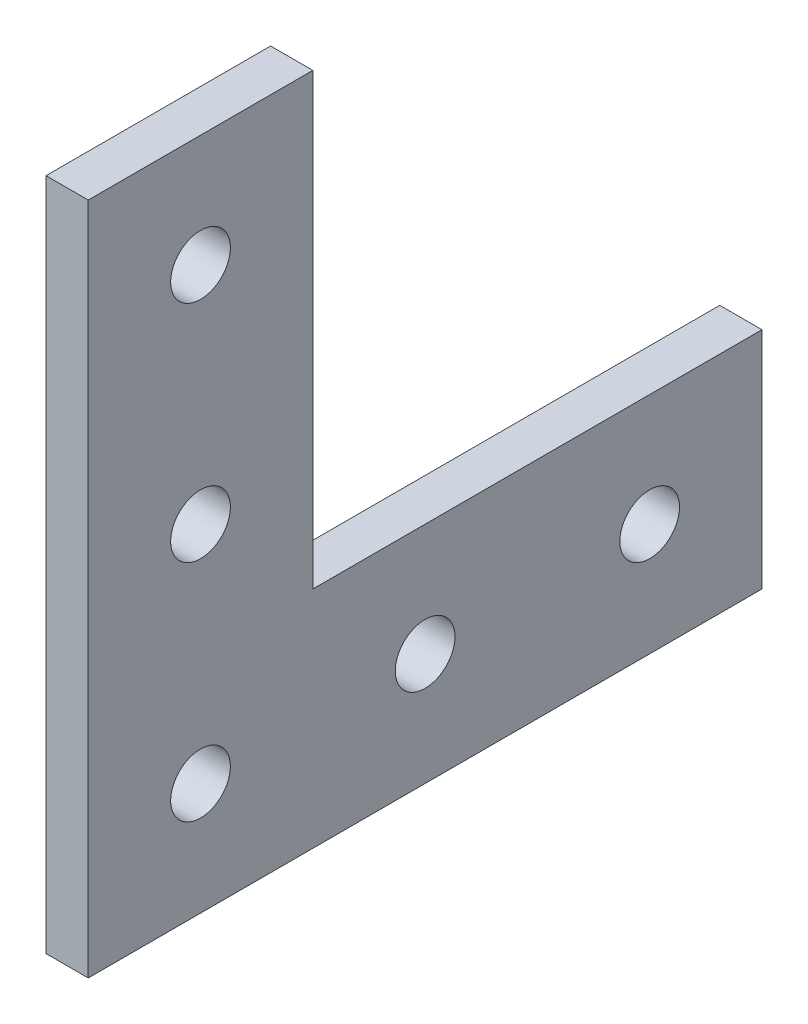
ISO-10303-21;
HEADER;
FILE_DESCRIPTION(('STEP AP214'),'2;1');
FILE_NAME('part.step','',(''),(''),'','','');
FILE_SCHEMA(('AUTOMOTIVE_DESIGN { 1 0 10303 214 1 1 1 1 }'));
ENDSEC;
DATA;
#1=APPLICATION_CONTEXT('core data for automotive mechanical design processes');
#2=APPLICATION_PROTOCOL_DEFINITION('international standard','automotive_design',2000,#1);
#3=PRODUCT_CONTEXT('',#1,'mechanical');
#4=PRODUCT('Part','Part','',(#3));
#5=PRODUCT_RELATED_PRODUCT_CATEGORY('part','',(#4));
#6=PRODUCT_DEFINITION_FORMATION('','',#4);
#7=PRODUCT_DEFINITION_CONTEXT('part definition',#1,'design');
#8=PRODUCT_DEFINITION('design','',#6,#7);
#9=PRODUCT_DEFINITION_SHAPE('','',#8);
#10=(LENGTH_UNIT() NAMED_UNIT(*) SI_UNIT(.MILLI.,.METRE.));
#11=(NAMED_UNIT(*) PLANE_ANGLE_UNIT() SI_UNIT($,.RADIAN.));
#12=(NAMED_UNIT(*) SI_UNIT($,.STERADIAN.) SOLID_ANGLE_UNIT());
#13=UNCERTAINTY_MEASURE_WITH_UNIT(LENGTH_MEASURE(1.E-05),#10,'distance_accuracy_value','');
#14=(GEOMETRIC_REPRESENTATION_CONTEXT(3) GLOBAL_UNCERTAINTY_ASSIGNED_CONTEXT((#13)) GLOBAL_UNIT_ASSIGNED_CONTEXT((#10,
#11,#12)) REPRESENTATION_CONTEXT('',''));
#15=CARTESIAN_POINT('',(0.,0.,0.));
#16=DIRECTION('',(0.,0.,1.));
#17=DIRECTION('',(1.,0.,0.));
#18=AXIS2_PLACEMENT_3D('',#15,#16,#17);
#19=CARTESIAN_POINT('',(4.7752,0.,0.));
#20=DIRECTION('',(0.,-1.,0.));
#21=DIRECTION('',(0.,0.,-1.));
#22=AXIS2_PLACEMENT_3D('',#19,#20,#21);
#23=PLANE('',#22);
#24=DIRECTION('',(0.,0.,1.));
#25=VECTOR('',#24,1.);
#26=CARTESIAN_POINT('',(0.,0.,0.));
#27=LINE('',#26,#25);
#28=CARTESIAN_POINT('',(0.,0.,-50.8));
#29=VERTEX_POINT('',#28);
#30=CARTESIAN_POINT('',(0.,0.,0.));
#31=VERTEX_POINT('',#30);
#32=EDGE_CURVE('E119',#29,#31,#27,.T.);
#33=ORIENTED_EDGE('',*,*,#32,.T.);
#34=DIRECTION('',(-1.,0.,0.));
#35=VECTOR('',#34,1.);
#36=CARTESIAN_POINT('',(4.7752,0.,0.));
#37=LINE('',#36,#35);
#38=CARTESIAN_POINT('',(4.7752,0.,0.));
#39=VERTEX_POINT('',#38);
#40=EDGE_CURVE('E11',#39,#31,#37,.T.);
#41=ORIENTED_EDGE('',*,*,#40,.F.);
#42=DIRECTION('',(0.,0.,1.));
#43=VECTOR('',#42,1.);
#44=CARTESIAN_POINT('',(4.7752,0.,0.));
#45=LINE('',#44,#43);
#46=CARTESIAN_POINT('',(4.7752,0.,-50.8));
#47=VERTEX_POINT('',#46);
#48=EDGE_CURVE('E130',#47,#39,#45,.T.);
#49=ORIENTED_EDGE('',*,*,#48,.F.);
#50=DIRECTION('',(-1.,0.,0.));
#51=VECTOR('',#50,1.);
#52=CARTESIAN_POINT('',(4.7752,0.,-50.8));
#53=LINE('',#52,#51);
#54=EDGE_CURVE('E115',#47,#29,#53,.T.);
#55=ORIENTED_EDGE('',*,*,#54,.T.);
#56=EDGE_LOOP('',(#33,#41,#49,#55));
#57=FACE_BOUND('',#56,.T.);
#58=ADVANCED_FACE('F34',(#57),#23,.F.);
#59=CARTESIAN_POINT('',(4.7752,0.,0.));
#60=DIRECTION('',(0.,0.,1.));
#61=DIRECTION('',(0.,-1.,0.));
#62=AXIS2_PLACEMENT_3D('',#59,#60,#61);
#63=PLANE('',#62);
#64=DIRECTION('',(0.,1.,0.));
#65=VECTOR('',#64,1.);
#66=CARTESIAN_POINT('',(0.,0.,0.));
#67=LINE('',#66,#65);
#68=CARTESIAN_POINT('',(0.,50.8,0.));
#69=VERTEX_POINT('',#68);
#70=EDGE_CURVE('E122',#31,#69,#67,.T.);
#71=ORIENTED_EDGE('',*,*,#70,.T.);
#72=DIRECTION('',(-1.,0.,0.));
#73=VECTOR('',#72,1.);
#74=CARTESIAN_POINT('',(4.7752,50.8,0.));
#75=LINE('',#74,#73);
#76=CARTESIAN_POINT('',(4.7752,50.8,0.));
#77=VERTEX_POINT('',#76);
#78=EDGE_CURVE('E43',#77,#69,#75,.T.);
#79=ORIENTED_EDGE('',*,*,#78,.F.);
#80=DIRECTION('',(0.,1.,0.));
#81=VECTOR('',#80,1.);
#82=CARTESIAN_POINT('',(4.7752,0.,0.));
#83=LINE('',#82,#81);
#84=EDGE_CURVE('E88',#39,#77,#83,.T.);
#85=ORIENTED_EDGE('',*,*,#84,.F.);
#86=ORIENTED_EDGE('',*,*,#40,.T.);
#87=EDGE_LOOP('',(#71,#79,#85,#86));
#88=FACE_BOUND('',#87,.T.);
#89=ADVANCED_FACE('F156',(#88),#63,.F.);
#90=CARTESIAN_POINT('',(4.7752,50.8,25.4));
#91=DIRECTION('',(0.,-1.,0.));
#92=DIRECTION('',(0.,0.,-1.));
#93=AXIS2_PLACEMENT_3D('',#90,#91,#92);
#94=PLANE('',#93);
#95=DIRECTION('',(0.,0.,1.));
#96=VECTOR('',#95,1.);
#97=CARTESIAN_POINT('',(0.,50.8,25.4));
#98=LINE('',#97,#96);
#99=CARTESIAN_POINT('',(0.,50.8,25.4));
#100=VERTEX_POINT('',#99);
#101=EDGE_CURVE('E125',#69,#100,#98,.T.);
#102=ORIENTED_EDGE('',*,*,#101,.T.);
#103=DIRECTION('',(-1.,0.,0.));
#104=VECTOR('',#103,1.);
#105=CARTESIAN_POINT('',(4.7752,50.8,25.4));
#106=LINE('',#105,#104);
#107=CARTESIAN_POINT('',(4.7752,50.8,25.4));
#108=VERTEX_POINT('',#107);
#109=EDGE_CURVE('E110',#108,#100,#106,.T.);
#110=ORIENTED_EDGE('',*,*,#109,.F.);
#111=DIRECTION('',(0.,0.,1.));
#112=VECTOR('',#111,1.);
#113=CARTESIAN_POINT('',(4.7752,50.8,25.4));
#114=LINE('',#113,#112);
#115=EDGE_CURVE('E101',#77,#108,#114,.T.);
#116=ORIENTED_EDGE('',*,*,#115,.F.);
#117=ORIENTED_EDGE('',*,*,#78,.T.);
#118=EDGE_LOOP('',(#102,#110,#116,#117));
#119=FACE_BOUND('',#118,.T.);
#120=ADVANCED_FACE('F137',(#119),#94,.F.);
#121=CARTESIAN_POINT('',(4.7752,-25.4,25.4));
#122=DIRECTION('',(0.,0.,-1.));
#123=DIRECTION('',(0.,1.,0.));
#124=AXIS2_PLACEMENT_3D('',#121,#122,#123);
#125=PLANE('',#124);
#126=DIRECTION('',(0.,-1.,0.));
#127=VECTOR('',#126,1.);
#128=CARTESIAN_POINT('',(0.,-25.4,25.4));
#129=LINE('',#128,#127);
#130=CARTESIAN_POINT('',(0.,-25.4,25.4));
#131=VERTEX_POINT('',#130);
#132=EDGE_CURVE('E109',#100,#131,#129,.T.);
#133=ORIENTED_EDGE('',*,*,#132,.T.);
#134=DIRECTION('',(-1.,0.,0.));
#135=VECTOR('',#134,1.);
#136=CARTESIAN_POINT('',(4.7752,-25.4,25.4));
#137=LINE('',#136,#135);
#138=CARTESIAN_POINT('',(4.7752,-25.4,25.4));
#139=VERTEX_POINT('',#138);
#140=EDGE_CURVE('E106',#139,#131,#137,.T.);
#141=ORIENTED_EDGE('',*,*,#140,.F.);
#142=DIRECTION('',(0.,-1.,0.));
#143=VECTOR('',#142,1.);
#144=CARTESIAN_POINT('',(4.7752,-25.4,25.4));
#145=LINE('',#144,#143);
#146=EDGE_CURVE('E95',#108,#139,#145,.T.);
#147=ORIENTED_EDGE('',*,*,#146,.F.);
#148=ORIENTED_EDGE('',*,*,#109,.T.);
#149=EDGE_LOOP('',(#133,#141,#147,#148));
#150=FACE_BOUND('',#149,.T.);
#151=ADVANCED_FACE('F107',(#150),#125,.F.);
#152=CARTESIAN_POINT('',(4.7752,-25.4,25.4));
#153=DIRECTION('',(0.,1.,0.));
#154=DIRECTION('',(0.,0.,1.));
#155=AXIS2_PLACEMENT_3D('',#152,#153,#154);
#156=PLANE('',#155);
#157=DIRECTION('',(0.,0.,-1.));
#158=VECTOR('',#157,1.);
#159=CARTESIAN_POINT('',(0.,-25.4,25.4));
#160=LINE('',#159,#158);
#161=CARTESIAN_POINT('',(0.,-25.4,-50.8));
#162=VERTEX_POINT('',#161);
#163=EDGE_CURVE('E74',#131,#162,#160,.T.);
#164=ORIENTED_EDGE('',*,*,#163,.T.);
#165=DIRECTION('',(-1.,0.,0.));
#166=VECTOR('',#165,1.);
#167=CARTESIAN_POINT('',(4.7752,-25.4,-50.8));
#168=LINE('',#167,#166);
#169=CARTESIAN_POINT('',(4.7752,-25.4,-50.8));
#170=VERTEX_POINT('',#169);
#171=EDGE_CURVE('E111',#170,#162,#168,.T.);
#172=ORIENTED_EDGE('',*,*,#171,.F.);
#173=DIRECTION('',(0.,0.,-1.));
#174=VECTOR('',#173,1.);
#175=CARTESIAN_POINT('',(4.7752,-25.4,25.4));
#176=LINE('',#175,#174);
#177=EDGE_CURVE('E99',#139,#170,#176,.T.);
#178=ORIENTED_EDGE('',*,*,#177,.F.);
#179=ORIENTED_EDGE('',*,*,#140,.T.);
#180=EDGE_LOOP('',(#164,#172,#178,#179));
#181=FACE_BOUND('',#180,.T.);
#182=ADVANCED_FACE('F113',(#181),#156,.F.);
#183=CARTESIAN_POINT('',(4.7752,0.,-50.8));
#184=DIRECTION('',(0.,0.,1.));
#185=DIRECTION('',(1.,0.,0.));
#186=AXIS2_PLACEMENT_3D('',#183,#184,#185);
#187=PLANE('',#186);
#188=DIRECTION('',(0.,1.,0.));
#189=VECTOR('',#188,1.);
#190=CARTESIAN_POINT('',(0.,0.,-50.8));
#191=LINE('',#190,#189);
#192=EDGE_CURVE('E80',#162,#29,#191,.T.);
#193=ORIENTED_EDGE('',*,*,#192,.T.);
#194=ORIENTED_EDGE('',*,*,#54,.F.);
#195=DIRECTION('',(0.,1.,0.));
#196=VECTOR('',#195,1.);
#197=CARTESIAN_POINT('',(4.7752,0.,-50.8));
#198=LINE('',#197,#196);
#199=EDGE_CURVE('E51',#170,#47,#198,.T.);
#200=ORIENTED_EDGE('',*,*,#199,.F.);
#201=ORIENTED_EDGE('',*,*,#171,.T.);
#202=EDGE_LOOP('',(#193,#194,#200,#201));
#203=FACE_BOUND('',#202,.T.);
#204=ADVANCED_FACE('F144',(#203),#187,.F.);
#205=CARTESIAN_POINT('',(4.7752,0.,0.));
#206=DIRECTION('',(-1.,0.,0.));
#207=DIRECTION('',(0.,0.,1.));
#208=AXIS2_PLACEMENT_3D('',#205,#206,#207);
#209=PLANE('',#208);
#210=CARTESIAN_POINT('',(4.7752,-12.7,12.7));
#211=DIRECTION('',(1.,0.,0.));
#212=DIRECTION('',(0.,0.,-1.));
#213=AXIS2_PLACEMENT_3D('',#210,#211,#212);
#214=CIRCLE('',#213,3.3782);
#215=CARTESIAN_POINT('',(4.7752,-12.7,9.32179999999999));
#216=VERTEX_POINT('',#215);
#217=EDGE_CURVE('E252',#216,#216,#214,.T.);
#218=ORIENTED_EDGE('',*,*,#217,.F.);
#219=EDGE_LOOP('',(#218));
#220=FACE_BOUND('',#219,.T.);
#221=CARTESIAN_POINT('',(4.7752,-12.7,-12.7));
#222=DIRECTION('',(1.,0.,0.));
#223=DIRECTION('',(0.,0.,-1.));
#224=AXIS2_PLACEMENT_3D('',#221,#222,#223);
#225=CIRCLE('',#224,3.3782);
#226=CARTESIAN_POINT('',(4.7752,-12.7,-16.0782));
#227=VERTEX_POINT('',#226);
#228=EDGE_CURVE('E254',#227,#227,#225,.T.);
#229=ORIENTED_EDGE('',*,*,#228,.F.);
#230=EDGE_LOOP('',(#229));
#231=FACE_BOUND('',#230,.T.);
#232=CARTESIAN_POINT('',(4.7752,-12.7,-38.1));
#233=DIRECTION('',(1.,0.,0.));
#234=DIRECTION('',(0.,0.,-1.));
#235=AXIS2_PLACEMENT_3D('',#232,#233,#234);
#236=CIRCLE('',#235,3.3782);
#237=CARTESIAN_POINT('',(4.7752,-12.7,-41.4782));
#238=VERTEX_POINT('',#237);
#239=EDGE_CURVE('E262',#238,#238,#236,.T.);
#240=ORIENTED_EDGE('',*,*,#239,.F.);
#241=EDGE_LOOP('',(#240));
#242=FACE_BOUND('',#241,.T.);
#243=CARTESIAN_POINT('',(4.7752,12.7,12.7));
#244=DIRECTION('',(1.,0.,0.));
#245=DIRECTION('',(0.,0.,-1.));
#246=AXIS2_PLACEMENT_3D('',#243,#244,#245);
#247=CIRCLE('',#246,3.3782);
#248=CARTESIAN_POINT('',(4.7752,12.7,9.3218));
#249=VERTEX_POINT('',#248);
#250=EDGE_CURVE('E265',#249,#249,#247,.T.);
#251=ORIENTED_EDGE('',*,*,#250,.F.);
#252=EDGE_LOOP('',(#251));
#253=FACE_BOUND('',#252,.T.);
#254=CARTESIAN_POINT('',(4.7752,38.1,12.7));
#255=DIRECTION('',(1.,0.,0.));
#256=DIRECTION('',(0.,0.,-1.));
#257=AXIS2_PLACEMENT_3D('',#254,#255,#256);
#258=CIRCLE('',#257,3.3782);
#259=CARTESIAN_POINT('',(4.7752,38.1,9.3218));
#260=VERTEX_POINT('',#259);
#261=EDGE_CURVE('E271',#260,#260,#258,.T.);
#262=ORIENTED_EDGE('',*,*,#261,.F.);
#263=EDGE_LOOP('',(#262));
#264=FACE_BOUND('',#263,.T.);
#265=ORIENTED_EDGE('',*,*,#48,.T.);
#266=ORIENTED_EDGE('',*,*,#84,.T.);
#267=ORIENTED_EDGE('',*,*,#115,.T.);
#268=ORIENTED_EDGE('',*,*,#146,.T.);
#269=ORIENTED_EDGE('',*,*,#177,.T.);
#270=ORIENTED_EDGE('',*,*,#199,.T.);
#271=EDGE_LOOP('',(#265,#266,#267,#268,#269,#270));
#272=FACE_BOUND('',#271,.T.);
#273=ADVANCED_FACE('F97',(#220,#231,#242,#253,#264,#272),#209,.F.);
#274=CARTESIAN_POINT('',(0.,0.,0.));
#275=DIRECTION('',(-1.,0.,0.));
#276=DIRECTION('',(0.,0.,1.));
#277=AXIS2_PLACEMENT_3D('',#274,#275,#276);
#278=PLANE('',#277);
#279=CARTESIAN_POINT('',(0.,-12.7,12.7));
#280=DIRECTION('',(-1.,0.,0.));
#281=DIRECTION('',(0.,0.,1.));
#282=AXIS2_PLACEMENT_3D('',#279,#280,#281);
#283=CIRCLE('',#282,3.3782);
#284=CARTESIAN_POINT('',(0.,-12.7,16.0782));
#285=VERTEX_POINT('',#284);
#286=EDGE_CURVE('E249',#285,#285,#283,.T.);
#287=ORIENTED_EDGE('',*,*,#286,.F.);
#288=EDGE_LOOP('',(#287));
#289=FACE_BOUND('',#288,.T.);
#290=CARTESIAN_POINT('',(0.,-12.7,-12.7));
#291=DIRECTION('',(-1.,0.,0.));
#292=DIRECTION('',(0.,0.,1.));
#293=AXIS2_PLACEMENT_3D('',#290,#291,#292);
#294=CIRCLE('',#293,3.3782);
#295=CARTESIAN_POINT('',(0.,-12.7,-9.32180000000001));
#296=VERTEX_POINT('',#295);
#297=EDGE_CURVE('E259',#296,#296,#294,.T.);
#298=ORIENTED_EDGE('',*,*,#297,.F.);
#299=EDGE_LOOP('',(#298));
#300=FACE_BOUND('',#299,.T.);
#301=CARTESIAN_POINT('',(0.,-12.7,-38.1));
#302=DIRECTION('',(-1.,0.,0.));
#303=DIRECTION('',(0.,0.,1.));
#304=AXIS2_PLACEMENT_3D('',#301,#302,#303);
#305=CIRCLE('',#304,3.3782);
#306=CARTESIAN_POINT('',(0.,-12.7,-34.7218));
#307=VERTEX_POINT('',#306);
#308=EDGE_CURVE('E37',#307,#307,#305,.T.);
#309=ORIENTED_EDGE('',*,*,#308,.F.);
#310=EDGE_LOOP('',(#309));
#311=FACE_BOUND('',#310,.T.);
#312=CARTESIAN_POINT('',(0.,12.7,12.7));
#313=DIRECTION('',(-1.,0.,0.));
#314=DIRECTION('',(0.,0.,1.));
#315=AXIS2_PLACEMENT_3D('',#312,#313,#314);
#316=CIRCLE('',#315,3.3782);
#317=CARTESIAN_POINT('',(0.,12.7,16.0782));
#318=VERTEX_POINT('',#317);
#319=EDGE_CURVE('E268',#318,#318,#316,.T.);
#320=ORIENTED_EDGE('',*,*,#319,.F.);
#321=EDGE_LOOP('',(#320));
#322=FACE_BOUND('',#321,.T.);
#323=CARTESIAN_POINT('',(0.,38.1,12.7));
#324=DIRECTION('',(-1.,0.,0.));
#325=DIRECTION('',(0.,0.,1.));
#326=AXIS2_PLACEMENT_3D('',#323,#324,#325);
#327=CIRCLE('',#326,3.3782);
#328=CARTESIAN_POINT('',(0.,38.1,16.0782));
#329=VERTEX_POINT('',#328);
#330=EDGE_CURVE('E123',#329,#329,#327,.T.);
#331=ORIENTED_EDGE('',*,*,#330,.F.);
#332=EDGE_LOOP('',(#331));
#333=FACE_BOUND('',#332,.T.);
#334=ORIENTED_EDGE('',*,*,#32,.F.);
#335=ORIENTED_EDGE('',*,*,#192,.F.);
#336=ORIENTED_EDGE('',*,*,#163,.F.);
#337=ORIENTED_EDGE('',*,*,#132,.F.);
#338=ORIENTED_EDGE('',*,*,#101,.F.);
#339=ORIENTED_EDGE('',*,*,#70,.F.);
#340=EDGE_LOOP('',(#334,#335,#336,#337,#338,#339));
#341=FACE_BOUND('',#340,.T.);
#342=ADVANCED_FACE('F140',(#289,#300,#311,#322,#333,#341),#278,.T.);
#343=CARTESIAN_POINT('',(4.7752,38.1,12.7));
#344=DIRECTION('',(1.,0.,0.));
#345=DIRECTION('',(0.,0.,-1.));
#346=AXIS2_PLACEMENT_3D('',#343,#344,#345);
#347=CYLINDRICAL_SURFACE('',#346,3.3782);
#348=ORIENTED_EDGE('',*,*,#330,.T.);
#349=EDGE_LOOP('',(#348));
#350=FACE_BOUND('',#349,.T.);
#351=ORIENTED_EDGE('',*,*,#261,.T.);
#352=EDGE_LOOP('',(#351));
#353=FACE_BOUND('',#352,.T.);
#354=ADVANCED_FACE('F193',(#350,#353),#347,.F.);
#355=CARTESIAN_POINT('',(4.7752,12.7,12.7));
#356=DIRECTION('',(1.,0.,0.));
#357=DIRECTION('',(0.,0.,-1.));
#358=AXIS2_PLACEMENT_3D('',#355,#356,#357);
#359=CYLINDRICAL_SURFACE('',#358,3.3782);
#360=ORIENTED_EDGE('',*,*,#319,.T.);
#361=EDGE_LOOP('',(#360));
#362=FACE_BOUND('',#361,.T.);
#363=ORIENTED_EDGE('',*,*,#250,.T.);
#364=EDGE_LOOP('',(#363));
#365=FACE_BOUND('',#364,.T.);
#366=ADVANCED_FACE('F202',(#362,#365),#359,.F.);
#367=CARTESIAN_POINT('',(4.7752,-12.7,-38.1));
#368=DIRECTION('',(1.,0.,0.));
#369=DIRECTION('',(0.,0.,-1.));
#370=AXIS2_PLACEMENT_3D('',#367,#368,#369);
#371=CYLINDRICAL_SURFACE('',#370,3.3782);
#372=ORIENTED_EDGE('',*,*,#308,.T.);
#373=EDGE_LOOP('',(#372));
#374=FACE_BOUND('',#373,.T.);
#375=ORIENTED_EDGE('',*,*,#239,.T.);
#376=EDGE_LOOP('',(#375));
#377=FACE_BOUND('',#376,.T.);
#378=ADVANCED_FACE('F212',(#374,#377),#371,.F.);
#379=CARTESIAN_POINT('',(4.7752,-12.7,-12.7));
#380=DIRECTION('',(1.,0.,0.));
#381=DIRECTION('',(0.,0.,-1.));
#382=AXIS2_PLACEMENT_3D('',#379,#380,#381);
#383=CYLINDRICAL_SURFACE('',#382,3.3782);
#384=ORIENTED_EDGE('',*,*,#297,.T.);
#385=EDGE_LOOP('',(#384));
#386=FACE_BOUND('',#385,.T.);
#387=ORIENTED_EDGE('',*,*,#228,.T.);
#388=EDGE_LOOP('',(#387));
#389=FACE_BOUND('',#388,.T.);
#390=ADVANCED_FACE('F222',(#386,#389),#383,.F.);
#391=CARTESIAN_POINT('',(4.7752,-12.7,12.7));
#392=DIRECTION('',(1.,0.,0.));
#393=DIRECTION('',(0.,0.,-1.));
#394=AXIS2_PLACEMENT_3D('',#391,#392,#393);
#395=CYLINDRICAL_SURFACE('',#394,3.3782);
#396=ORIENTED_EDGE('',*,*,#286,.T.);
#397=EDGE_LOOP('',(#396));
#398=FACE_BOUND('',#397,.T.);
#399=ORIENTED_EDGE('',*,*,#217,.T.);
#400=EDGE_LOOP('',(#399));
#401=FACE_BOUND('',#400,.T.);
#402=ADVANCED_FACE('F232',(#398,#401),#395,.F.);
#403=CLOSED_SHELL('',(#58,#89,#120,#151,#182,#204,#273,#342,#354,#366,#378,#390,#402));
#404=MANIFOLD_SOLID_BREP('B2',#403);
#405=ADVANCED_BREP_SHAPE_REPRESENTATION('',(#18,#404),#14);
#406=SHAPE_DEFINITION_REPRESENTATION(#9,#405);
ENDSEC;
END-ISO-10303-21;
